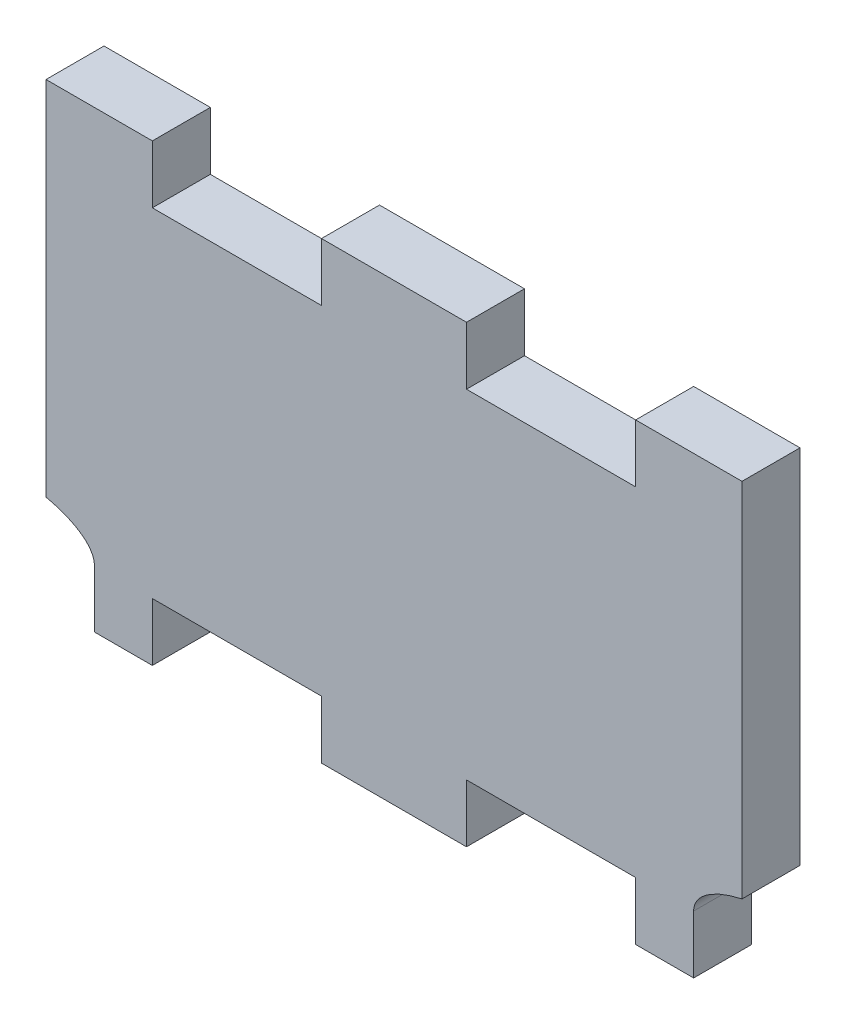
ISO-10303-21;
HEADER;
FILE_DESCRIPTION(('STEP AP214'),'2;1');
FILE_NAME('part.step','',(''),(''),'','','');
FILE_SCHEMA(('AUTOMOTIVE_DESIGN { 1 0 10303 214 1 1 1 1 }'));
ENDSEC;
DATA;
#1=APPLICATION_CONTEXT('core data for automotive mechanical design processes');
#2=APPLICATION_PROTOCOL_DEFINITION('international standard','automotive_design',2000,#1);
#3=PRODUCT_CONTEXT('',#1,'mechanical');
#4=PRODUCT('Part','Part','',(#3));
#5=PRODUCT_RELATED_PRODUCT_CATEGORY('part','',(#4));
#6=PRODUCT_DEFINITION_FORMATION('','',#4);
#7=PRODUCT_DEFINITION_CONTEXT('part definition',#1,'design');
#8=PRODUCT_DEFINITION('design','',#6,#7);
#9=PRODUCT_DEFINITION_SHAPE('','',#8);
#10=(LENGTH_UNIT() NAMED_UNIT(*) SI_UNIT(.MILLI.,.METRE.));
#11=(NAMED_UNIT(*) PLANE_ANGLE_UNIT() SI_UNIT($,.RADIAN.));
#12=(NAMED_UNIT(*) SI_UNIT($,.STERADIAN.) SOLID_ANGLE_UNIT());
#13=UNCERTAINTY_MEASURE_WITH_UNIT(LENGTH_MEASURE(1.E-05),#10,'distance_accuracy_value','');
#14=(GEOMETRIC_REPRESENTATION_CONTEXT(3) GLOBAL_UNCERTAINTY_ASSIGNED_CONTEXT((#13)) GLOBAL_UNIT_ASSIGNED_CONTEXT((#10,
#11,#12)) REPRESENTATION_CONTEXT('',''));
#15=CARTESIAN_POINT('',(0.,0.,0.));
#16=DIRECTION('',(0.,0.,1.));
#17=DIRECTION('',(1.,0.,0.));
#18=AXIS2_PLACEMENT_3D('',#15,#16,#17);
#19=CARTESIAN_POINT('',(-80.,6.,6.));
#20=DIRECTION('',(0.,0.,1.));
#21=DIRECTION('',(1.,0.,0.));
#22=AXIS2_PLACEMENT_3D('',#19,#20,#21);
#23=ELLIPSE('',#22,8.99999999999999,4.);
#24=DIRECTION('',(0.,0.,-1.));
#25=VECTOR('',#24,1.);
#26=SURFACE_OF_LINEAR_EXTRUSION('',#23,#25);
#27=CARTESIAN_POINT('',(-80.,6.,0.));
#28=DIRECTION('',(0.,0.,1.));
#29=DIRECTION('',(1.,0.,0.));
#30=AXIS2_PLACEMENT_3D('',#27,#28,#29);
#31=ELLIPSE('',#30,8.99999999999999,4.);
#32=CARTESIAN_POINT('',(-71.,6.,0.));
#33=VERTEX_POINT('',#32);
#34=CARTESIAN_POINT('',(-76.,9.58322566591047,0.));
#35=VERTEX_POINT('',#34);
#36=EDGE_CURVE('E229',#33,#35,#31,.T.);
#37=ORIENTED_EDGE('',*,*,#36,.F.);
#38=DIRECTION('',(0.,0.,-1.));
#39=VECTOR('',#38,1.);
#40=CARTESIAN_POINT('',(-71.,6.,6.));
#41=LINE('',#40,#39);
#42=CARTESIAN_POINT('',(-71.,6.,6.));
#43=VERTEX_POINT('',#42);
#44=EDGE_CURVE('E11',#43,#33,#41,.T.);
#45=ORIENTED_EDGE('',*,*,#44,.F.);
#46=CARTESIAN_POINT('',(-76.,9.58322566591047,6.));
#47=VERTEX_POINT('',#46);
#48=EDGE_CURVE('E290',#43,#47,#23,.T.);
#49=ORIENTED_EDGE('',*,*,#48,.T.);
#50=DIRECTION('',(0.,0.,-1.));
#51=VECTOR('',#50,1.);
#52=CARTESIAN_POINT('',(-76.,9.58322566591047,6.));
#53=LINE('',#52,#51);
#54=EDGE_CURVE('E51',#47,#35,#53,.T.);
#55=ORIENTED_EDGE('',*,*,#54,.T.);
#56=EDGE_LOOP('',(#37,#45,#49,#55));
#57=FACE_BOUND('',#56,.T.);
#58=ADVANCED_FACE('F34',(#57),#26,.T.);
#59=CARTESIAN_POINT('',(-71.,0.,6.));
#60=DIRECTION('',(1.,0.,0.));
#61=DIRECTION('',(0.,0.,-1.));
#62=AXIS2_PLACEMENT_3D('',#59,#60,#61);
#63=PLANE('',#62);
#64=DIRECTION('',(0.,-1.,0.));
#65=VECTOR('',#64,1.);
#66=CARTESIAN_POINT('',(-71.,0.,0.));
#67=LINE('',#66,#65);
#68=CARTESIAN_POINT('',(-71.,0.,0.));
#69=VERTEX_POINT('',#68);
#70=EDGE_CURVE('E231',#33,#69,#67,.T.);
#71=ORIENTED_EDGE('',*,*,#70,.T.);
#72=DIRECTION('',(0.,0.,-1.));
#73=VECTOR('',#72,1.);
#74=CARTESIAN_POINT('',(-71.,0.,6.));
#75=LINE('',#74,#73);
#76=CARTESIAN_POINT('',(-71.,0.,6.));
#77=VERTEX_POINT('',#76);
#78=EDGE_CURVE('E43',#77,#69,#75,.T.);
#79=ORIENTED_EDGE('',*,*,#78,.F.);
#80=DIRECTION('',(0.,-1.,0.));
#81=VECTOR('',#80,1.);
#82=CARTESIAN_POINT('',(-71.,0.,6.));
#83=LINE('',#82,#81);
#84=EDGE_CURVE('E350',#43,#77,#83,.T.);
#85=ORIENTED_EDGE('',*,*,#84,.F.);
#86=ORIENTED_EDGE('',*,*,#44,.T.);
#87=EDGE_LOOP('',(#71,#79,#85,#86));
#88=FACE_BOUND('',#87,.T.);
#89=ADVANCED_FACE('F338',(#88),#63,.F.);
#90=CARTESIAN_POINT('',(0.,0.,6.));
#91=DIRECTION('',(0.,-1.,0.));
#92=DIRECTION('',(1.,0.,0.));
#93=AXIS2_PLACEMENT_3D('',#90,#91,#92);
#94=PLANE('',#93);
#95=DIRECTION('',(-1.,0.,0.));
#96=VECTOR('',#95,1.);
#97=CARTESIAN_POINT('',(0.,0.,0.));
#98=LINE('',#97,#96);
#99=CARTESIAN_POINT('',(-65.,0.,0.));
#100=VERTEX_POINT('',#99);
#101=EDGE_CURVE('E234',#100,#69,#98,.T.);
#102=ORIENTED_EDGE('',*,*,#101,.F.);
#103=DIRECTION('',(0.,0.,-1.));
#104=VECTOR('',#103,1.);
#105=CARTESIAN_POINT('',(-65.,0.,6.));
#106=LINE('',#105,#104);
#107=CARTESIAN_POINT('',(-65.,0.,6.));
#108=VERTEX_POINT('',#107);
#109=EDGE_CURVE('E328',#108,#100,#106,.T.);
#110=ORIENTED_EDGE('',*,*,#109,.F.);
#111=DIRECTION('',(-1.,0.,0.));
#112=VECTOR('',#111,1.);
#113=CARTESIAN_POINT('',(0.,0.,6.));
#114=LINE('',#113,#112);
#115=EDGE_CURVE('E335',#108,#77,#114,.T.);
#116=ORIENTED_EDGE('',*,*,#115,.T.);
#117=ORIENTED_EDGE('',*,*,#78,.T.);
#118=EDGE_LOOP('',(#102,#110,#116,#117));
#119=FACE_BOUND('',#118,.T.);
#120=ADVANCED_FACE('F333',(#119),#94,.T.);
#121=CARTESIAN_POINT('',(-65.,0.,6.));
#122=DIRECTION('',(1.,0.,0.));
#123=DIRECTION('',(0.,0.,-1.));
#124=AXIS2_PLACEMENT_3D('',#121,#122,#123);
#125=PLANE('',#124);
#126=DIRECTION('',(0.,-1.,0.));
#127=VECTOR('',#126,1.);
#128=CARTESIAN_POINT('',(-65.,0.,0.));
#129=LINE('',#128,#127);
#130=CARTESIAN_POINT('',(-65.,6.,0.));
#131=VERTEX_POINT('',#130);
#132=EDGE_CURVE('E237',#131,#100,#129,.T.);
#133=ORIENTED_EDGE('',*,*,#132,.F.);
#134=DIRECTION('',(0.,0.,-1.));
#135=VECTOR('',#134,1.);
#136=CARTESIAN_POINT('',(-65.,6.,6.));
#137=LINE('',#136,#135);
#138=CARTESIAN_POINT('',(-65.,6.,6.));
#139=VERTEX_POINT('',#138);
#140=EDGE_CURVE('E326',#139,#131,#137,.T.);
#141=ORIENTED_EDGE('',*,*,#140,.F.);
#142=DIRECTION('',(0.,-1.,0.));
#143=VECTOR('',#142,1.);
#144=CARTESIAN_POINT('',(-65.,0.,6.));
#145=LINE('',#144,#143);
#146=EDGE_CURVE('E347',#139,#108,#145,.T.);
#147=ORIENTED_EDGE('',*,*,#146,.T.);
#148=ORIENTED_EDGE('',*,*,#109,.T.);
#149=EDGE_LOOP('',(#133,#141,#147,#148));
#150=FACE_BOUND('',#149,.T.);
#151=ADVANCED_FACE('F344',(#150),#125,.T.);
#152=CARTESIAN_POINT('',(0.,5.99999999999998,6.));
#153=DIRECTION('',(0.,-1.,0.));
#154=DIRECTION('',(1.,0.,0.));
#155=AXIS2_PLACEMENT_3D('',#152,#153,#154);
#156=PLANE('',#155);
#157=DIRECTION('',(-1.,0.,0.));
#158=VECTOR('',#157,1.);
#159=CARTESIAN_POINT('',(0.,5.99999999999998,0.));
#160=LINE('',#159,#158);
#161=CARTESIAN_POINT('',(-47.5,5.99999999999999,0.));
#162=VERTEX_POINT('',#161);
#163=EDGE_CURVE('E242',#162,#131,#160,.T.);
#164=ORIENTED_EDGE('',*,*,#163,.F.);
#165=DIRECTION('',(0.,0.,-1.));
#166=VECTOR('',#165,1.);
#167=CARTESIAN_POINT('',(-47.5,5.99999999999999,6.));
#168=LINE('',#167,#166);
#169=CARTESIAN_POINT('',(-47.5,5.99999999999999,6.));
#170=VERTEX_POINT('',#169);
#171=EDGE_CURVE('E324',#170,#162,#168,.T.);
#172=ORIENTED_EDGE('',*,*,#171,.F.);
#173=DIRECTION('',(-1.,0.,0.));
#174=VECTOR('',#173,1.);
#175=CARTESIAN_POINT('',(0.,5.99999999999998,6.));
#176=LINE('',#175,#174);
#177=EDGE_CURVE('E354',#170,#139,#176,.T.);
#178=ORIENTED_EDGE('',*,*,#177,.T.);
#179=ORIENTED_EDGE('',*,*,#140,.T.);
#180=EDGE_LOOP('',(#164,#172,#178,#179));
#181=FACE_BOUND('',#180,.T.);
#182=ADVANCED_FACE('F417',(#181),#156,.T.);
#183=CARTESIAN_POINT('',(-47.5,0.,6.));
#184=DIRECTION('',(-1.,0.,0.));
#185=DIRECTION('',(0.,0.,1.));
#186=AXIS2_PLACEMENT_3D('',#183,#184,#185);
#187=PLANE('',#186);
#188=DIRECTION('',(0.,1.,0.));
#189=VECTOR('',#188,1.);
#190=CARTESIAN_POINT('',(-47.5,0.,0.));
#191=LINE('',#190,#189);
#192=CARTESIAN_POINT('',(-47.5,0.,0.));
#193=VERTEX_POINT('',#192);
#194=EDGE_CURVE('E245',#193,#162,#191,.T.);
#195=ORIENTED_EDGE('',*,*,#194,.F.);
#196=DIRECTION('',(0.,0.,-1.));
#197=VECTOR('',#196,1.);
#198=CARTESIAN_POINT('',(-47.5,0.,6.));
#199=LINE('',#198,#197);
#200=CARTESIAN_POINT('',(-47.5,0.,6.));
#201=VERTEX_POINT('',#200);
#202=EDGE_CURVE('E322',#201,#193,#199,.T.);
#203=ORIENTED_EDGE('',*,*,#202,.F.);
#204=DIRECTION('',(0.,1.,0.));
#205=VECTOR('',#204,1.);
#206=CARTESIAN_POINT('',(-47.5,0.,6.));
#207=LINE('',#206,#205);
#208=EDGE_CURVE('E362',#201,#170,#207,.T.);
#209=ORIENTED_EDGE('',*,*,#208,.T.);
#210=ORIENTED_EDGE('',*,*,#171,.T.);
#211=EDGE_LOOP('',(#195,#203,#209,#210));
#212=FACE_BOUND('',#211,.T.);
#213=ADVANCED_FACE('F414',(#212),#187,.T.);
#214=CARTESIAN_POINT('',(-32.5,0.,0.));
#215=VERTEX_POINT('',#214);
#216=EDGE_CURVE('E239',#215,#193,#98,.T.);
#217=ORIENTED_EDGE('',*,*,#216,.F.);
#218=DIRECTION('',(0.,0.,-1.));
#219=VECTOR('',#218,1.);
#220=CARTESIAN_POINT('',(-32.5,0.,6.));
#221=LINE('',#220,#219);
#222=CARTESIAN_POINT('',(-32.5,0.,6.));
#223=VERTEX_POINT('',#222);
#224=EDGE_CURVE('E320',#223,#215,#221,.T.);
#225=ORIENTED_EDGE('',*,*,#224,.F.);
#226=EDGE_CURVE('E353',#223,#201,#114,.T.);
#227=ORIENTED_EDGE('',*,*,#226,.T.);
#228=ORIENTED_EDGE('',*,*,#202,.T.);
#229=EDGE_LOOP('',(#217,#225,#227,#228));
#230=FACE_BOUND('',#229,.T.);
#231=ADVANCED_FACE('F402',(#230),#94,.T.);
#232=CARTESIAN_POINT('',(-32.5,0.,6.));
#233=DIRECTION('',(1.,0.,0.));
#234=DIRECTION('',(0.,0.,-1.));
#235=AXIS2_PLACEMENT_3D('',#232,#233,#234);
#236=PLANE('',#235);
#237=DIRECTION('',(0.,-1.,0.));
#238=VECTOR('',#237,1.);
#239=CARTESIAN_POINT('',(-32.5,0.,0.));
#240=LINE('',#239,#238);
#241=CARTESIAN_POINT('',(-32.5,6.,0.));
#242=VERTEX_POINT('',#241);
#243=EDGE_CURVE('E248',#242,#215,#240,.T.);
#244=ORIENTED_EDGE('',*,*,#243,.F.);
#245=DIRECTION('',(0.,0.,-1.));
#246=VECTOR('',#245,1.);
#247=CARTESIAN_POINT('',(-32.5,6.,6.));
#248=LINE('',#247,#246);
#249=CARTESIAN_POINT('',(-32.5,6.,6.));
#250=VERTEX_POINT('',#249);
#251=EDGE_CURVE('E318',#250,#242,#248,.T.);
#252=ORIENTED_EDGE('',*,*,#251,.F.);
#253=DIRECTION('',(0.,-1.,0.));
#254=VECTOR('',#253,1.);
#255=CARTESIAN_POINT('',(-32.5,0.,6.));
#256=LINE('',#255,#254);
#257=EDGE_CURVE('E361',#250,#223,#256,.T.);
#258=ORIENTED_EDGE('',*,*,#257,.T.);
#259=ORIENTED_EDGE('',*,*,#224,.T.);
#260=EDGE_LOOP('',(#244,#252,#258,#259));
#261=FACE_BOUND('',#260,.T.);
#262=ADVANCED_FACE('F409',(#261),#236,.T.);
#263=CARTESIAN_POINT('',(0.,6.,6.));
#264=DIRECTION('',(0.,-1.,0.));
#265=DIRECTION('',(1.,0.,0.));
#266=AXIS2_PLACEMENT_3D('',#263,#264,#265);
#267=PLANE('',#266);
#268=DIRECTION('',(-1.,0.,0.));
#269=VECTOR('',#268,1.);
#270=CARTESIAN_POINT('',(0.,6.,0.));
#271=LINE('',#270,#269);
#272=CARTESIAN_POINT('',(-15.,6.,0.));
#273=VERTEX_POINT('',#272);
#274=EDGE_CURVE('E251',#273,#242,#271,.T.);
#275=ORIENTED_EDGE('',*,*,#274,.F.);
#276=DIRECTION('',(0.,0.,-1.));
#277=VECTOR('',#276,1.);
#278=CARTESIAN_POINT('',(-15.,6.,6.));
#279=LINE('',#278,#277);
#280=CARTESIAN_POINT('',(-15.,6.,6.));
#281=VERTEX_POINT('',#280);
#282=EDGE_CURVE('E316',#281,#273,#279,.T.);
#283=ORIENTED_EDGE('',*,*,#282,.F.);
#284=DIRECTION('',(-1.,0.,0.));
#285=VECTOR('',#284,1.);
#286=CARTESIAN_POINT('',(0.,6.,6.));
#287=LINE('',#286,#285);
#288=EDGE_CURVE('E366',#281,#250,#287,.T.);
#289=ORIENTED_EDGE('',*,*,#288,.T.);
#290=ORIENTED_EDGE('',*,*,#251,.T.);
#291=EDGE_LOOP('',(#275,#283,#289,#290));
#292=FACE_BOUND('',#291,.T.);
#293=ADVANCED_FACE('F405',(#292),#267,.T.);
#294=CARTESIAN_POINT('',(-15.,0.,6.));
#295=DIRECTION('',(-1.,0.,0.));
#296=DIRECTION('',(0.,-1.,0.));
#297=AXIS2_PLACEMENT_3D('',#294,#295,#296);
#298=PLANE('',#297);
#299=DIRECTION('',(0.,1.,0.));
#300=VECTOR('',#299,1.);
#301=CARTESIAN_POINT('',(-15.,0.,0.));
#302=LINE('',#301,#300);
#303=CARTESIAN_POINT('',(-15.,0.,0.));
#304=VERTEX_POINT('',#303);
#305=EDGE_CURVE('E254',#304,#273,#302,.T.);
#306=ORIENTED_EDGE('',*,*,#305,.F.);
#307=DIRECTION('',(0.,0.,-1.));
#308=VECTOR('',#307,1.);
#309=CARTESIAN_POINT('',(-15.,0.,6.));
#310=LINE('',#309,#308);
#311=CARTESIAN_POINT('',(-15.,0.,6.));
#312=VERTEX_POINT('',#311);
#313=EDGE_CURVE('E314',#312,#304,#310,.T.);
#314=ORIENTED_EDGE('',*,*,#313,.F.);
#315=DIRECTION('',(0.,1.,0.));
#316=VECTOR('',#315,1.);
#317=CARTESIAN_POINT('',(-15.,0.,6.));
#318=LINE('',#317,#316);
#319=EDGE_CURVE('E359',#312,#281,#318,.T.);
#320=ORIENTED_EDGE('',*,*,#319,.T.);
#321=ORIENTED_EDGE('',*,*,#282,.T.);
#322=EDGE_LOOP('',(#306,#314,#320,#321));
#323=FACE_BOUND('',#322,.T.);
#324=ADVANCED_FACE('F400',(#323),#298,.T.);
#325=CARTESIAN_POINT('',(-9.,0.,0.));
#326=VERTEX_POINT('',#325);
#327=EDGE_CURVE('E238',#326,#304,#98,.T.);
#328=ORIENTED_EDGE('',*,*,#327,.F.);
#329=DIRECTION('',(0.,0.,-1.));
#330=VECTOR('',#329,1.);
#331=CARTESIAN_POINT('',(-9.,0.,6.));
#332=LINE('',#331,#330);
#333=CARTESIAN_POINT('',(-9.,0.,6.));
#334=VERTEX_POINT('',#333);
#335=EDGE_CURVE('E312',#334,#326,#332,.T.);
#336=ORIENTED_EDGE('',*,*,#335,.F.);
#337=EDGE_CURVE('E352',#334,#312,#114,.T.);
#338=ORIENTED_EDGE('',*,*,#337,.T.);
#339=ORIENTED_EDGE('',*,*,#313,.T.);
#340=EDGE_LOOP('',(#328,#336,#338,#339));
#341=FACE_BOUND('',#340,.T.);
#342=ADVANCED_FACE('F396',(#341),#94,.T.);
#343=CARTESIAN_POINT('',(-9.,0.,6.));
#344=DIRECTION('',(1.,0.,0.));
#345=DIRECTION('',(0.,0.,-1.));
#346=AXIS2_PLACEMENT_3D('',#343,#344,#345);
#347=PLANE('',#346);
#348=DIRECTION('',(0.,-1.,0.));
#349=VECTOR('',#348,1.);
#350=CARTESIAN_POINT('',(-9.,0.,0.));
#351=LINE('',#350,#349);
#352=CARTESIAN_POINT('',(-9.,6.,0.));
#353=VERTEX_POINT('',#352);
#354=EDGE_CURVE('E257',#353,#326,#351,.T.);
#355=ORIENTED_EDGE('',*,*,#354,.F.);
#356=DIRECTION('',(0.,0.,-1.));
#357=VECTOR('',#356,1.);
#358=CARTESIAN_POINT('',(-9.,6.,6.));
#359=LINE('',#358,#357);
#360=CARTESIAN_POINT('',(-9.,6.,6.));
#361=VERTEX_POINT('',#360);
#362=EDGE_CURVE('E310',#361,#353,#359,.T.);
#363=ORIENTED_EDGE('',*,*,#362,.F.);
#364=DIRECTION('',(0.,-1.,0.));
#365=VECTOR('',#364,1.);
#366=CARTESIAN_POINT('',(-9.,0.,6.));
#367=LINE('',#366,#365);
#368=EDGE_CURVE('E358',#361,#334,#367,.T.);
#369=ORIENTED_EDGE('',*,*,#368,.T.);
#370=ORIENTED_EDGE('',*,*,#335,.T.);
#371=EDGE_LOOP('',(#355,#363,#369,#370));
#372=FACE_BOUND('',#371,.T.);
#373=ADVANCED_FACE('F391',(#372),#347,.T.);
#374=CARTESIAN_POINT('',(0.,6.,6.));
#375=DIRECTION('',(0.,0.,1.));
#376=DIRECTION('',(-1.,0.,0.));
#377=AXIS2_PLACEMENT_3D('',#374,#375,#376);
#378=ELLIPSE('',#377,9.,4.);
#379=DIRECTION('',(0.,0.,-1.));
#380=VECTOR('',#379,1.);
#381=SURFACE_OF_LINEAR_EXTRUSION('',#378,#380);
#382=CARTESIAN_POINT('',(0.,6.,0.));
#383=DIRECTION('',(0.,0.,1.));
#384=DIRECTION('',(-1.,0.,0.));
#385=AXIS2_PLACEMENT_3D('',#382,#383,#384);
#386=ELLIPSE('',#385,9.,4.);
#387=CARTESIAN_POINT('',(-4.,9.58322566591049,0.));
#388=VERTEX_POINT('',#387);
#389=EDGE_CURVE('E260',#388,#353,#386,.T.);
#390=ORIENTED_EDGE('',*,*,#389,.F.);
#391=DIRECTION('',(0.,0.,-1.));
#392=VECTOR('',#391,1.);
#393=CARTESIAN_POINT('',(-4.,9.58322566591049,6.));
#394=LINE('',#393,#392);
#395=CARTESIAN_POINT('',(-4.,9.58322566591049,6.));
#396=VERTEX_POINT('',#395);
#397=EDGE_CURVE('E308',#396,#388,#394,.T.);
#398=ORIENTED_EDGE('',*,*,#397,.F.);
#399=EDGE_CURVE('E380',#396,#361,#378,.T.);
#400=ORIENTED_EDGE('',*,*,#399,.T.);
#401=ORIENTED_EDGE('',*,*,#362,.T.);
#402=EDGE_LOOP('',(#390,#398,#400,#401));
#403=FACE_BOUND('',#402,.T.);
#404=ADVANCED_FACE('F386',(#403),#381,.T.);
#405=CARTESIAN_POINT('',(-4.,0.,6.));
#406=DIRECTION('',(1.,0.,0.));
#407=DIRECTION('',(0.,0.,-1.));
#408=AXIS2_PLACEMENT_3D('',#405,#406,#407);
#409=PLANE('',#408);
#410=DIRECTION('',(0.,-1.,0.));
#411=VECTOR('',#410,1.);
#412=CARTESIAN_POINT('',(-4.,0.,0.));
#413=LINE('',#412,#411);
#414=CARTESIAN_POINT('',(-4.,47.,0.));
#415=VERTEX_POINT('',#414);
#416=EDGE_CURVE('E263',#415,#388,#413,.T.);
#417=ORIENTED_EDGE('',*,*,#416,.F.);
#418=DIRECTION('',(0.,0.,-1.));
#419=VECTOR('',#418,1.);
#420=CARTESIAN_POINT('',(-4.,47.,6.));
#421=LINE('',#420,#419);
#422=CARTESIAN_POINT('',(-4.,47.,6.));
#423=VERTEX_POINT('',#422);
#424=EDGE_CURVE('E306',#423,#415,#421,.T.);
#425=ORIENTED_EDGE('',*,*,#424,.F.);
#426=DIRECTION('',(0.,-1.,0.));
#427=VECTOR('',#426,1.);
#428=CARTESIAN_POINT('',(-4.,0.,6.));
#429=LINE('',#428,#427);
#430=EDGE_CURVE('E384',#423,#396,#429,.T.);
#431=ORIENTED_EDGE('',*,*,#430,.T.);
#432=ORIENTED_EDGE('',*,*,#397,.T.);
#433=EDGE_LOOP('',(#417,#425,#431,#432));
#434=FACE_BOUND('',#433,.T.);
#435=ADVANCED_FACE('F390',(#434),#409,.T.);
#436=CARTESIAN_POINT('',(0.,47.,6.));
#437=DIRECTION('',(0.,-1.,0.));
#438=DIRECTION('',(0.,0.,-1.));
#439=AXIS2_PLACEMENT_3D('',#436,#437,#438);
#440=PLANE('',#439);
#441=DIRECTION('',(-1.,0.,0.));
#442=VECTOR('',#441,1.);
#443=CARTESIAN_POINT('',(0.,47.,0.));
#444=LINE('',#443,#442);
#445=CARTESIAN_POINT('',(-15.,47.,0.));
#446=VERTEX_POINT('',#445);
#447=EDGE_CURVE('E266',#415,#446,#444,.T.);
#448=ORIENTED_EDGE('',*,*,#447,.T.);
#449=DIRECTION('',(0.,0.,-1.));
#450=VECTOR('',#449,1.);
#451=CARTESIAN_POINT('',(-15.,47.,6.));
#452=LINE('',#451,#450);
#453=CARTESIAN_POINT('',(-15.,47.,6.));
#454=VERTEX_POINT('',#453);
#455=EDGE_CURVE('E304',#454,#446,#452,.T.);
#456=ORIENTED_EDGE('',*,*,#455,.F.);
#457=DIRECTION('',(-1.,0.,0.));
#458=VECTOR('',#457,1.);
#459=CARTESIAN_POINT('',(0.,47.,6.));
#460=LINE('',#459,#458);
#461=EDGE_CURVE('E216',#423,#454,#460,.T.);
#462=ORIENTED_EDGE('',*,*,#461,.F.);
#463=ORIENTED_EDGE('',*,*,#424,.T.);
#464=EDGE_LOOP('',(#448,#456,#462,#463));
#465=FACE_BOUND('',#464,.T.);
#466=ADVANCED_FACE('F438',(#465),#440,.F.);
#467=CARTESIAN_POINT('',(-15.,0.,6.));
#468=DIRECTION('',(-1.,0.,0.));
#469=DIRECTION('',(0.,0.,1.));
#470=AXIS2_PLACEMENT_3D('',#467,#468,#469);
#471=PLANE('',#470);
#472=DIRECTION('',(0.,1.,0.));
#473=VECTOR('',#472,1.);
#474=CARTESIAN_POINT('',(-15.,0.,0.));
#475=LINE('',#474,#473);
#476=CARTESIAN_POINT('',(-15.,41.,0.));
#477=VERTEX_POINT('',#476);
#478=EDGE_CURVE('E269',#477,#446,#475,.T.);
#479=ORIENTED_EDGE('',*,*,#478,.F.);
#480=DIRECTION('',(0.,0.,-1.));
#481=VECTOR('',#480,1.);
#482=CARTESIAN_POINT('',(-15.,41.,6.));
#483=LINE('',#482,#481);
#484=CARTESIAN_POINT('',(-15.,41.,6.));
#485=VERTEX_POINT('',#484);
#486=EDGE_CURVE('E302',#485,#477,#483,.T.);
#487=ORIENTED_EDGE('',*,*,#486,.F.);
#488=DIRECTION('',(0.,1.,0.));
#489=VECTOR('',#488,1.);
#490=CARTESIAN_POINT('',(-15.,0.,6.));
#491=LINE('',#490,#489);
#492=EDGE_CURVE('E480',#485,#454,#491,.T.);
#493=ORIENTED_EDGE('',*,*,#492,.T.);
#494=ORIENTED_EDGE('',*,*,#455,.T.);
#495=EDGE_LOOP('',(#479,#487,#493,#494));
#496=FACE_BOUND('',#495,.T.);
#497=ADVANCED_FACE('F458',(#496),#471,.T.);
#498=CARTESIAN_POINT('',(0.,41.,6.));
#499=DIRECTION('',(0.,1.,0.));
#500=DIRECTION('',(-1.,0.,0.));
#501=AXIS2_PLACEMENT_3D('',#498,#499,#500);
#502=PLANE('',#501);
#503=DIRECTION('',(1.,0.,0.));
#504=VECTOR('',#503,1.);
#505=CARTESIAN_POINT('',(0.,41.,0.));
#506=LINE('',#505,#504);
#507=CARTESIAN_POINT('',(-32.5,41.,0.));
#508=VERTEX_POINT('',#507);
#509=EDGE_CURVE('E274',#508,#477,#506,.T.);
#510=ORIENTED_EDGE('',*,*,#509,.F.);
#511=DIRECTION('',(0.,0.,-1.));
#512=VECTOR('',#511,1.);
#513=CARTESIAN_POINT('',(-32.5,41.,6.));
#514=LINE('',#513,#512);
#515=CARTESIAN_POINT('',(-32.5,41.,6.));
#516=VERTEX_POINT('',#515);
#517=EDGE_CURVE('E300',#516,#508,#514,.T.);
#518=ORIENTED_EDGE('',*,*,#517,.F.);
#519=DIRECTION('',(1.,0.,0.));
#520=VECTOR('',#519,1.);
#521=CARTESIAN_POINT('',(0.,41.,6.));
#522=LINE('',#521,#520);
#523=EDGE_CURVE('E476',#516,#485,#522,.T.);
#524=ORIENTED_EDGE('',*,*,#523,.T.);
#525=ORIENTED_EDGE('',*,*,#486,.T.);
#526=EDGE_LOOP('',(#510,#518,#524,#525));
#527=FACE_BOUND('',#526,.T.);
#528=ADVANCED_FACE('F455',(#527),#502,.T.);
#529=CARTESIAN_POINT('',(-32.5,0.,6.));
#530=DIRECTION('',(1.,0.,0.));
#531=DIRECTION('',(0.,0.,-1.));
#532=AXIS2_PLACEMENT_3D('',#529,#530,#531);
#533=PLANE('',#532);
#534=DIRECTION('',(0.,-1.,0.));
#535=VECTOR('',#534,1.);
#536=CARTESIAN_POINT('',(-32.5,0.,0.));
#537=LINE('',#536,#535);
#538=CARTESIAN_POINT('',(-32.5,47.,0.));
#539=VERTEX_POINT('',#538);
#540=EDGE_CURVE('E277',#539,#508,#537,.T.);
#541=ORIENTED_EDGE('',*,*,#540,.F.);
#542=DIRECTION('',(0.,0.,-1.));
#543=VECTOR('',#542,1.);
#544=CARTESIAN_POINT('',(-32.5,47.,6.));
#545=LINE('',#544,#543);
#546=CARTESIAN_POINT('',(-32.5,47.,6.));
#547=VERTEX_POINT('',#546);
#548=EDGE_CURVE('E298',#547,#539,#545,.T.);
#549=ORIENTED_EDGE('',*,*,#548,.F.);
#550=DIRECTION('',(0.,-1.,0.));
#551=VECTOR('',#550,1.);
#552=CARTESIAN_POINT('',(-32.5,0.,6.));
#553=LINE('',#552,#551);
#554=EDGE_CURVE('E479',#547,#516,#553,.T.);
#555=ORIENTED_EDGE('',*,*,#554,.T.);
#556=ORIENTED_EDGE('',*,*,#517,.T.);
#557=EDGE_LOOP('',(#541,#549,#555,#556));
#558=FACE_BOUND('',#557,.T.);
#559=ADVANCED_FACE('F452',(#558),#533,.T.);
#560=CARTESIAN_POINT('',(-47.5,47.,0.));
#561=VERTEX_POINT('',#560);
#562=EDGE_CURVE('E271',#539,#561,#444,.T.);
#563=ORIENTED_EDGE('',*,*,#562,.T.);
#564=DIRECTION('',(0.,0.,-1.));
#565=VECTOR('',#564,1.);
#566=CARTESIAN_POINT('',(-47.5,47.,6.));
#567=LINE('',#566,#565);
#568=CARTESIAN_POINT('',(-47.5,47.,6.));
#569=VERTEX_POINT('',#568);
#570=EDGE_CURVE('E296',#569,#561,#567,.T.);
#571=ORIENTED_EDGE('',*,*,#570,.F.);
#572=EDGE_CURVE('E215',#547,#569,#460,.T.);
#573=ORIENTED_EDGE('',*,*,#572,.F.);
#574=ORIENTED_EDGE('',*,*,#548,.T.);
#575=EDGE_LOOP('',(#563,#571,#573,#574));
#576=FACE_BOUND('',#575,.T.);
#577=ADVANCED_FACE('F439',(#576),#440,.F.);
#578=CARTESIAN_POINT('',(-47.5,0.,6.));
#579=DIRECTION('',(-1.,0.,0.));
#580=DIRECTION('',(0.,0.,1.));
#581=AXIS2_PLACEMENT_3D('',#578,#579,#580);
#582=PLANE('',#581);
#583=DIRECTION('',(0.,1.,0.));
#584=VECTOR('',#583,1.);
#585=CARTESIAN_POINT('',(-47.5,0.,0.));
#586=LINE('',#585,#584);
#587=CARTESIAN_POINT('',(-47.5,41.,0.));
#588=VERTEX_POINT('',#587);
#589=EDGE_CURVE('E280',#588,#561,#586,.T.);
#590=ORIENTED_EDGE('',*,*,#589,.F.);
#591=DIRECTION('',(0.,0.,-1.));
#592=VECTOR('',#591,1.);
#593=CARTESIAN_POINT('',(-47.5,41.,6.));
#594=LINE('',#593,#592);
#595=CARTESIAN_POINT('',(-47.5,41.,6.));
#596=VERTEX_POINT('',#595);
#597=EDGE_CURVE('E294',#596,#588,#594,.T.);
#598=ORIENTED_EDGE('',*,*,#597,.F.);
#599=DIRECTION('',(0.,1.,0.));
#600=VECTOR('',#599,1.);
#601=CARTESIAN_POINT('',(-47.5,0.,6.));
#602=LINE('',#601,#600);
#603=EDGE_CURVE('E224',#596,#569,#602,.T.);
#604=ORIENTED_EDGE('',*,*,#603,.T.);
#605=ORIENTED_EDGE('',*,*,#570,.T.);
#606=EDGE_LOOP('',(#590,#598,#604,#605));
#607=FACE_BOUND('',#606,.T.);
#608=ADVANCED_FACE('F447',(#607),#582,.T.);
#609=CARTESIAN_POINT('',(0.,41.,6.));
#610=DIRECTION('',(0.,1.,0.));
#611=DIRECTION('',(0.,0.,1.));
#612=AXIS2_PLACEMENT_3D('',#609,#610,#611);
#613=PLANE('',#612);
#614=DIRECTION('',(1.,0.,0.));
#615=VECTOR('',#614,1.);
#616=CARTESIAN_POINT('',(0.,41.,0.));
#617=LINE('',#616,#615);
#618=CARTESIAN_POINT('',(-65.,41.,0.));
#619=VERTEX_POINT('',#618);
#620=EDGE_CURVE('E283',#619,#588,#617,.T.);
#621=ORIENTED_EDGE('',*,*,#620,.F.);
#622=DIRECTION('',(0.,0.,-1.));
#623=VECTOR('',#622,1.);
#624=CARTESIAN_POINT('',(-65.,41.,6.));
#625=LINE('',#624,#623);
#626=CARTESIAN_POINT('',(-65.,41.,6.));
#627=VERTEX_POINT('',#626);
#628=EDGE_CURVE('E207',#627,#619,#625,.T.);
#629=ORIENTED_EDGE('',*,*,#628,.F.);
#630=DIRECTION('',(1.,0.,0.));
#631=VECTOR('',#630,1.);
#632=CARTESIAN_POINT('',(0.,41.,6.));
#633=LINE('',#632,#631);
#634=EDGE_CURVE('E222',#627,#596,#633,.T.);
#635=ORIENTED_EDGE('',*,*,#634,.T.);
#636=ORIENTED_EDGE('',*,*,#597,.T.);
#637=EDGE_LOOP('',(#621,#629,#635,#636));
#638=FACE_BOUND('',#637,.T.);
#639=ADVANCED_FACE('F444',(#638),#613,.T.);
#640=CARTESIAN_POINT('',(-65.,0.,6.));
#641=DIRECTION('',(1.,0.,0.));
#642=DIRECTION('',(0.,0.,-1.));
#643=AXIS2_PLACEMENT_3D('',#640,#641,#642);
#644=PLANE('',#643);
#645=DIRECTION('',(0.,-1.,0.));
#646=VECTOR('',#645,1.);
#647=CARTESIAN_POINT('',(-65.,0.,0.));
#648=LINE('',#647,#646);
#649=CARTESIAN_POINT('',(-65.,47.,0.));
#650=VERTEX_POINT('',#649);
#651=EDGE_CURVE('E204',#650,#619,#648,.T.);
#652=ORIENTED_EDGE('',*,*,#651,.F.);
#653=DIRECTION('',(0.,0.,-1.));
#654=VECTOR('',#653,1.);
#655=CARTESIAN_POINT('',(-65.,47.,6.));
#656=LINE('',#655,#654);
#657=CARTESIAN_POINT('',(-65.,47.,6.));
#658=VERTEX_POINT('',#657);
#659=EDGE_CURVE('E198',#658,#650,#656,.T.);
#660=ORIENTED_EDGE('',*,*,#659,.F.);
#661=DIRECTION('',(0.,-1.,0.));
#662=VECTOR('',#661,1.);
#663=CARTESIAN_POINT('',(-65.,0.,6.));
#664=LINE('',#663,#662);
#665=EDGE_CURVE('E202',#658,#627,#664,.T.);
#666=ORIENTED_EDGE('',*,*,#665,.T.);
#667=ORIENTED_EDGE('',*,*,#628,.T.);
#668=EDGE_LOOP('',(#652,#660,#666,#667));
#669=FACE_BOUND('',#668,.T.);
#670=ADVANCED_FACE('F200',(#669),#644,.T.);
#671=CARTESIAN_POINT('',(-76.,47.,0.));
#672=VERTEX_POINT('',#671);
#673=EDGE_CURVE('E270',#650,#672,#444,.T.);
#674=ORIENTED_EDGE('',*,*,#673,.T.);
#675=DIRECTION('',(0.,0.,-1.));
#676=VECTOR('',#675,1.);
#677=CARTESIAN_POINT('',(-76.,47.,6.));
#678=LINE('',#677,#676);
#679=CARTESIAN_POINT('',(-76.,47.,6.));
#680=VERTEX_POINT('',#679);
#681=EDGE_CURVE('E125',#680,#672,#678,.T.);
#682=ORIENTED_EDGE('',*,*,#681,.F.);
#683=EDGE_CURVE('E209',#658,#680,#460,.T.);
#684=ORIENTED_EDGE('',*,*,#683,.F.);
#685=ORIENTED_EDGE('',*,*,#659,.T.);
#686=EDGE_LOOP('',(#674,#682,#684,#685));
#687=FACE_BOUND('',#686,.T.);
#688=ADVANCED_FACE('F210',(#687),#440,.F.);
#689=CARTESIAN_POINT('',(-76.,0.,6.));
#690=DIRECTION('',(-1.,0.,0.));
#691=DIRECTION('',(0.,0.,1.));
#692=AXIS2_PLACEMENT_3D('',#689,#690,#691);
#693=PLANE('',#692);
#694=DIRECTION('',(0.,1.,0.));
#695=VECTOR('',#694,1.);
#696=CARTESIAN_POINT('',(-76.,0.,0.));
#697=LINE('',#696,#695);
#698=EDGE_CURVE('E287',#35,#672,#697,.T.);
#699=ORIENTED_EDGE('',*,*,#698,.F.);
#700=ORIENTED_EDGE('',*,*,#54,.F.);
#701=DIRECTION('',(0.,1.,0.));
#702=VECTOR('',#701,1.);
#703=CARTESIAN_POINT('',(-76.,0.,6.));
#704=LINE('',#703,#702);
#705=EDGE_CURVE('E213',#47,#680,#704,.T.);
#706=ORIENTED_EDGE('',*,*,#705,.T.);
#707=ORIENTED_EDGE('',*,*,#681,.T.);
#708=EDGE_LOOP('',(#699,#700,#706,#707));
#709=FACE_BOUND('',#708,.T.);
#710=ADVANCED_FACE('F429',(#709),#693,.T.);
#711=CARTESIAN_POINT('',(0.,0.,6.));
#712=DIRECTION('',(0.,0.,1.));
#713=DIRECTION('',(1.,0.,0.));
#714=AXIS2_PLACEMENT_3D('',#711,#712,#713);
#715=PLANE('',#714);
#716=ORIENTED_EDGE('',*,*,#48,.F.);
#717=ORIENTED_EDGE('',*,*,#84,.T.);
#718=ORIENTED_EDGE('',*,*,#115,.F.);
#719=ORIENTED_EDGE('',*,*,#146,.F.);
#720=ORIENTED_EDGE('',*,*,#177,.F.);
#721=ORIENTED_EDGE('',*,*,#208,.F.);
#722=ORIENTED_EDGE('',*,*,#226,.F.);
#723=ORIENTED_EDGE('',*,*,#257,.F.);
#724=ORIENTED_EDGE('',*,*,#288,.F.);
#725=ORIENTED_EDGE('',*,*,#319,.F.);
#726=ORIENTED_EDGE('',*,*,#337,.F.);
#727=ORIENTED_EDGE('',*,*,#368,.F.);
#728=ORIENTED_EDGE('',*,*,#399,.F.);
#729=ORIENTED_EDGE('',*,*,#430,.F.);
#730=ORIENTED_EDGE('',*,*,#461,.T.);
#731=ORIENTED_EDGE('',*,*,#492,.F.);
#732=ORIENTED_EDGE('',*,*,#523,.F.);
#733=ORIENTED_EDGE('',*,*,#554,.F.);
#734=ORIENTED_EDGE('',*,*,#572,.T.);
#735=ORIENTED_EDGE('',*,*,#603,.F.);
#736=ORIENTED_EDGE('',*,*,#634,.F.);
#737=ORIENTED_EDGE('',*,*,#665,.F.);
#738=ORIENTED_EDGE('',*,*,#683,.T.);
#739=ORIENTED_EDGE('',*,*,#705,.F.);
#740=EDGE_LOOP('',(#716,#717,#718,#719,#720,#721,#722,#723,#724,#725,#726,#727,#728,#729,#730,
#731,#732,#733,#734,#735,#736,#737,#738,#739));
#741=FACE_BOUND('',#740,.T.);
#742=ADVANCED_FACE('F219',(#741),#715,.T.);
#743=CARTESIAN_POINT('',(0.,0.,0.));
#744=DIRECTION('',(0.,0.,1.));
#745=DIRECTION('',(1.,0.,0.));
#746=AXIS2_PLACEMENT_3D('',#743,#744,#745);
#747=PLANE('',#746);
#748=ORIENTED_EDGE('',*,*,#36,.T.);
#749=ORIENTED_EDGE('',*,*,#698,.T.);
#750=ORIENTED_EDGE('',*,*,#673,.F.);
#751=ORIENTED_EDGE('',*,*,#651,.T.);
#752=ORIENTED_EDGE('',*,*,#620,.T.);
#753=ORIENTED_EDGE('',*,*,#589,.T.);
#754=ORIENTED_EDGE('',*,*,#562,.F.);
#755=ORIENTED_EDGE('',*,*,#540,.T.);
#756=ORIENTED_EDGE('',*,*,#509,.T.);
#757=ORIENTED_EDGE('',*,*,#478,.T.);
#758=ORIENTED_EDGE('',*,*,#447,.F.);
#759=ORIENTED_EDGE('',*,*,#416,.T.);
#760=ORIENTED_EDGE('',*,*,#389,.T.);
#761=ORIENTED_EDGE('',*,*,#354,.T.);
#762=ORIENTED_EDGE('',*,*,#327,.T.);
#763=ORIENTED_EDGE('',*,*,#305,.T.);
#764=ORIENTED_EDGE('',*,*,#274,.T.);
#765=ORIENTED_EDGE('',*,*,#243,.T.);
#766=ORIENTED_EDGE('',*,*,#216,.T.);
#767=ORIENTED_EDGE('',*,*,#194,.T.);
#768=ORIENTED_EDGE('',*,*,#163,.T.);
#769=ORIENTED_EDGE('',*,*,#132,.T.);
#770=ORIENTED_EDGE('',*,*,#101,.T.);
#771=ORIENTED_EDGE('',*,*,#70,.F.);
#772=EDGE_LOOP('',(#748,#749,#750,#751,#752,#753,#754,#755,#756,#757,#758,#759,#760,#761,#762,
#763,#764,#765,#766,#767,#768,#769,#770,#771));
#773=FACE_BOUND('',#772,.T.);
#774=ADVANCED_FACE('F340',(#773),#747,.F.);
#775=CLOSED_SHELL('',(#58,#89,#120,#151,#182,#213,#231,#262,#293,#324,#342,#373,#404,#435,#466,
#497,#528,#559,#577,#608,#639,#670,#688,#710,#742,#774));
#776=MANIFOLD_SOLID_BREP('B2',#775);
#777=ADVANCED_BREP_SHAPE_REPRESENTATION('',(#18,#776),#14);
#778=SHAPE_DEFINITION_REPRESENTATION(#9,#777);
ENDSEC;
END-ISO-10303-21;
